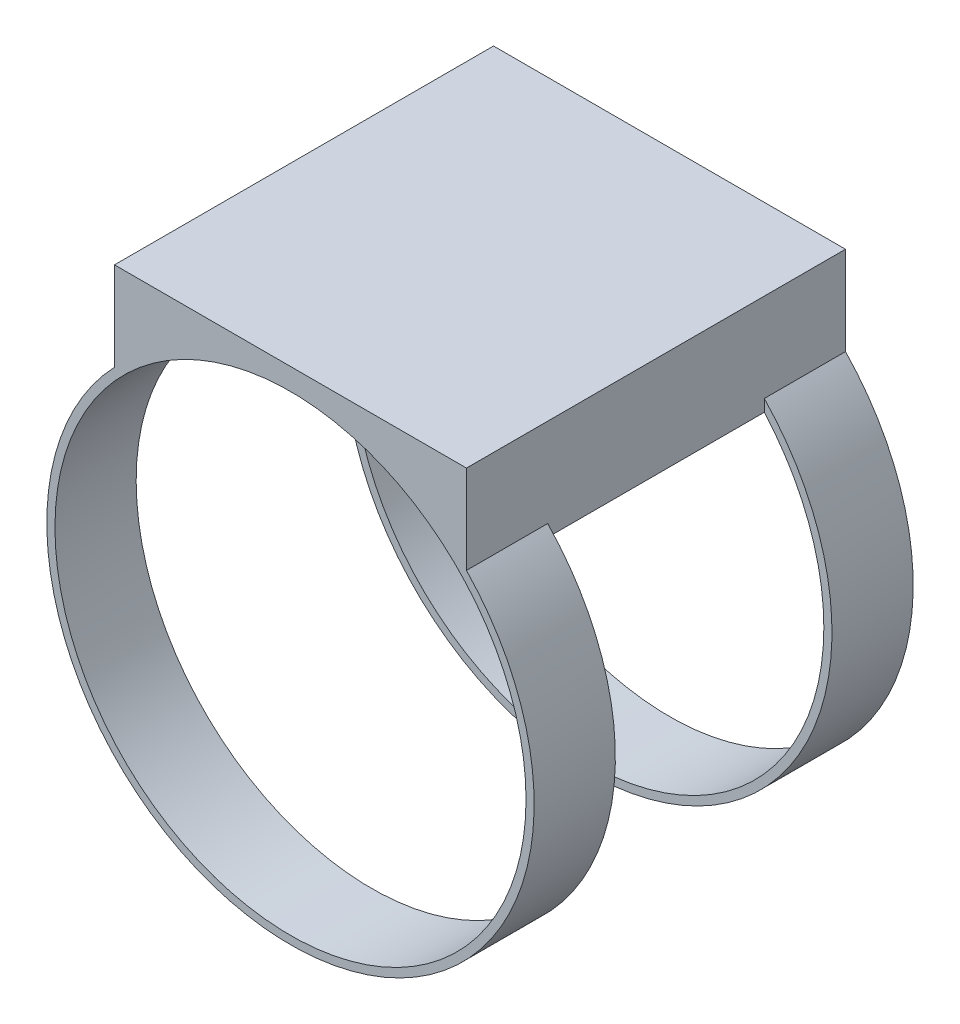
ISO-10303-21;
HEADER;
FILE_DESCRIPTION(('STEP AP214'),'2;1');
FILE_NAME('part.step','',(''),(''),'','','');
FILE_SCHEMA(('AUTOMOTIVE_DESIGN { 1 0 10303 214 1 1 1 1 }'));
ENDSEC;
DATA;
#1=APPLICATION_CONTEXT('core data for automotive mechanical design processes');
#2=APPLICATION_PROTOCOL_DEFINITION('international standard','automotive_design',2000,#1);
#3=PRODUCT_CONTEXT('',#1,'mechanical');
#4=PRODUCT('Part','Part','',(#3));
#5=PRODUCT_RELATED_PRODUCT_CATEGORY('part','',(#4));
#6=PRODUCT_DEFINITION_FORMATION('','',#4);
#7=PRODUCT_DEFINITION_CONTEXT('part definition',#1,'design');
#8=PRODUCT_DEFINITION('design','',#6,#7);
#9=PRODUCT_DEFINITION_SHAPE('','',#8);
#10=(LENGTH_UNIT() NAMED_UNIT(*) SI_UNIT(.MILLI.,.METRE.));
#11=(NAMED_UNIT(*) PLANE_ANGLE_UNIT() SI_UNIT($,.RADIAN.));
#12=(NAMED_UNIT(*) SI_UNIT($,.STERADIAN.) SOLID_ANGLE_UNIT());
#13=UNCERTAINTY_MEASURE_WITH_UNIT(LENGTH_MEASURE(1.E-05),#10,'distance_accuracy_value','');
#14=(GEOMETRIC_REPRESENTATION_CONTEXT(3) GLOBAL_UNCERTAINTY_ASSIGNED_CONTEXT((#13)) GLOBAL_UNIT_ASSIGNED_CONTEXT((#10,
#11,#12)) REPRESENTATION_CONTEXT('',''));
#15=CARTESIAN_POINT('',(0.,0.,0.));
#16=DIRECTION('',(0.,0.,1.));
#17=DIRECTION('',(1.,0.,0.));
#18=AXIS2_PLACEMENT_3D('',#15,#16,#17);
#19=CARTESIAN_POINT('',(0.,0.,30.));
#20=DIRECTION('',(0.,0.,1.));
#21=DIRECTION('',(1.,0.,0.));
#22=AXIS2_PLACEMENT_3D('',#19,#20,#21);
#23=PLANE('',#22);
#24=CARTESIAN_POINT('',(0.,0.,30.));
#25=DIRECTION('',(0.,0.,1.));
#26=DIRECTION('',(1.,0.,0.));
#27=AXIS2_PLACEMENT_3D('',#24,#25,#26);
#28=CIRCLE('',#27,90.);
#29=CARTESIAN_POINT('',(-65.,62.2494979899437,30.));
#30=VERTEX_POINT('',#29);
#31=CARTESIAN_POINT('',(65.,62.2494979899437,30.));
#32=VERTEX_POINT('',#31);
#33=EDGE_CURVE('E170',#30,#32,#28,.T.);
#34=ORIENTED_EDGE('',*,*,#33,.T.);
#35=DIRECTION('',(0.,-1.,0.));
#36=VECTOR('',#35,1.);
#37=CARTESIAN_POINT('',(65.,0.,30.));
#38=LINE('',#37,#36);
#39=CARTESIAN_POINT('',(65.,57.8273291792038,30.));
#40=VERTEX_POINT('',#39);
#41=EDGE_CURVE('E11',#32,#40,#38,.T.);
#42=ORIENTED_EDGE('',*,*,#41,.T.);
#43=CARTESIAN_POINT('',(0.,0.,30.));
#44=DIRECTION('',(0.,0.,1.));
#45=DIRECTION('',(1.,0.,0.));
#46=AXIS2_PLACEMENT_3D('',#43,#44,#45);
#47=CIRCLE('',#46,87.);
#48=CARTESIAN_POINT('',(-65.,57.8273291792038,30.));
#49=VERTEX_POINT('',#48);
#50=EDGE_CURVE('E195',#49,#40,#47,.T.);
#51=ORIENTED_EDGE('',*,*,#50,.F.);
#52=DIRECTION('',(0.,-1.,0.));
#53=VECTOR('',#52,1.);
#54=CARTESIAN_POINT('',(-65.,0.,30.));
#55=LINE('',#54,#53);
#56=EDGE_CURVE('E51',#30,#49,#55,.T.);
#57=ORIENTED_EDGE('',*,*,#56,.F.);
#58=EDGE_LOOP('',(#34,#42,#51,#57));
#59=FACE_BOUND('',#58,.T.);
#60=ADVANCED_FACE('F41',(#59),#23,.T.);
#61=CARTESIAN_POINT('',(0.,0.,30.));
#62=DIRECTION('',(0.,0.,-1.));
#63=DIRECTION('',(-1.,0.,0.));
#64=AXIS2_PLACEMENT_3D('',#61,#62,#63);
#65=CYLINDRICAL_SURFACE('',#64,90.);
#66=DIRECTION('',(0.,0.,-1.));
#67=VECTOR('',#66,1.);
#68=CARTESIAN_POINT('',(-65.,62.2494979899437,30.));
#69=LINE('',#68,#67);
#70=CARTESIAN_POINT('',(-65.,62.2494979899437,0.));
#71=VERTEX_POINT('',#70);
#72=EDGE_CURVE('E119',#71,#30,#69,.F.);
#73=ORIENTED_EDGE('',*,*,#72,.F.);
#74=CARTESIAN_POINT('',(0.,0.,0.));
#75=DIRECTION('',(0.,0.,1.));
#76=DIRECTION('',(1.,0.,0.));
#77=AXIS2_PLACEMENT_3D('',#74,#75,#76);
#78=CIRCLE('',#77,90.);
#79=CARTESIAN_POINT('',(65.,62.2494979899437,0.));
#80=VERTEX_POINT('',#79);
#81=EDGE_CURVE('E45',#71,#80,#78,.T.);
#82=ORIENTED_EDGE('',*,*,#81,.T.);
#83=DIRECTION('',(0.,0.,-1.));
#84=VECTOR('',#83,1.);
#85=CARTESIAN_POINT('',(65.,62.2494979899437,30.));
#86=LINE('',#85,#84);
#87=EDGE_CURVE('E175',#32,#80,#86,.T.);
#88=ORIENTED_EDGE('',*,*,#87,.F.);
#89=ORIENTED_EDGE('',*,*,#33,.F.);
#90=EDGE_LOOP('',(#73,#82,#88,#89));
#91=FACE_BOUND('',#90,.T.);
#92=ADVANCED_FACE('F43',(#91),#65,.T.);
#93=CARTESIAN_POINT('',(0.,0.,0.));
#94=DIRECTION('',(0.,0.,1.));
#95=DIRECTION('',(1.,0.,0.));
#96=AXIS2_PLACEMENT_3D('',#93,#94,#95);
#97=PLANE('',#96);
#98=ORIENTED_EDGE('',*,*,#81,.F.);
#99=DIRECTION('',(0.,-1.,0.));
#100=VECTOR('',#99,1.);
#101=CARTESIAN_POINT('',(-65.,95.,0.));
#102=LINE('',#101,#100);
#103=CARTESIAN_POINT('',(-65.,95.,0.));
#104=VERTEX_POINT('',#103);
#105=EDGE_CURVE('E188',#104,#71,#102,.T.);
#106=ORIENTED_EDGE('',*,*,#105,.F.);
#107=DIRECTION('',(-1.,0.,0.));
#108=VECTOR('',#107,1.);
#109=CARTESIAN_POINT('',(-65.,95.,0.));
#110=LINE('',#109,#108);
#111=CARTESIAN_POINT('',(65.,95.,0.));
#112=VERTEX_POINT('',#111);
#113=EDGE_CURVE('E185',#112,#104,#110,.T.);
#114=ORIENTED_EDGE('',*,*,#113,.F.);
#115=DIRECTION('',(0.,-1.,0.));
#116=VECTOR('',#115,1.);
#117=CARTESIAN_POINT('',(65.,95.,0.));
#118=LINE('',#117,#116);
#119=EDGE_CURVE('E191',#112,#80,#118,.T.);
#120=ORIENTED_EDGE('',*,*,#119,.T.);
#121=EDGE_LOOP('',(#98,#106,#114,#120));
#122=FACE_BOUND('',#121,.T.);
#123=CARTESIAN_POINT('',(0.,0.,0.));
#124=DIRECTION('',(0.,0.,1.));
#125=DIRECTION('',(1.,0.,0.));
#126=AXIS2_PLACEMENT_3D('',#123,#124,#125);
#127=CIRCLE('',#126,87.);
#128=CARTESIAN_POINT('',(87.,0.,0.));
#129=VERTEX_POINT('',#128);
#130=EDGE_CURVE('E194',#129,#129,#127,.T.);
#131=ORIENTED_EDGE('',*,*,#130,.T.);
#132=EDGE_LOOP('',(#131));
#133=FACE_BOUND('',#132,.T.);
#134=ADVANCED_FACE('F221',(#122,#133),#97,.F.);
#135=CARTESIAN_POINT('',(0.,0.,30.));
#136=DIRECTION('',(0.,0.,-1.));
#137=DIRECTION('',(-1.,0.,0.));
#138=AXIS2_PLACEMENT_3D('',#135,#136,#137);
#139=CYLINDRICAL_SURFACE('',#138,87.);
#140=ORIENTED_EDGE('',*,*,#50,.T.);
#141=DIRECTION('',(0.,0.,-1.));
#142=VECTOR('',#141,1.);
#143=CARTESIAN_POINT('',(65.,57.8273291792038,70.));
#144=LINE('',#143,#142);
#145=CARTESIAN_POINT('',(65.,57.8273291792038,110.));
#146=VERTEX_POINT('',#145);
#147=EDGE_CURVE('E120',#146,#40,#144,.T.);
#148=ORIENTED_EDGE('',*,*,#147,.F.);
#149=CARTESIAN_POINT('',(0.,0.,110.));
#150=DIRECTION('',(0.,0.,1.));
#151=DIRECTION('',(1.,0.,0.));
#152=AXIS2_PLACEMENT_3D('',#149,#150,#151);
#153=CIRCLE('',#152,87.);
#154=CARTESIAN_POINT('',(-65.,57.8273291792038,110.));
#155=VERTEX_POINT('',#154);
#156=EDGE_CURVE('E123',#155,#146,#153,.T.);
#157=ORIENTED_EDGE('',*,*,#156,.F.);
#158=DIRECTION('',(0.,0.,-1.));
#159=VECTOR('',#158,1.);
#160=CARTESIAN_POINT('',(-65.,57.8273291792038,70.));
#161=LINE('',#160,#159);
#162=EDGE_CURVE('E108',#155,#49,#161,.T.);
#163=ORIENTED_EDGE('',*,*,#162,.T.);
#164=EDGE_LOOP('',(#140,#148,#157,#163));
#165=FACE_BOUND('',#164,.T.);
#166=ORIENTED_EDGE('',*,*,#130,.F.);
#167=EDGE_LOOP('',(#166));
#168=FACE_BOUND('',#167,.T.);
#169=CARTESIAN_POINT('',(0.,0.,140.));
#170=DIRECTION('',(0.,0.,1.));
#171=DIRECTION('',(1.,0.,0.));
#172=AXIS2_PLACEMENT_3D('',#169,#170,#171);
#173=CIRCLE('',#172,87.);
#174=CARTESIAN_POINT('',(87.,0.,140.));
#175=VERTEX_POINT('',#174);
#176=EDGE_CURVE('E132',#175,#175,#173,.T.);
#177=ORIENTED_EDGE('',*,*,#176,.T.);
#178=EDGE_LOOP('',(#177));
#179=FACE_BOUND('',#178,.T.);
#180=ADVANCED_FACE('F124',(#165,#168,#179),#139,.F.);
#181=CARTESIAN_POINT('',(-65.,95.,0.));
#182=DIRECTION('',(1.,0.,0.));
#183=DIRECTION('',(0.,0.,-1.));
#184=AXIS2_PLACEMENT_3D('',#181,#182,#183);
#185=PLANE('',#184);
#186=ORIENTED_EDGE('',*,*,#105,.T.);
#187=ORIENTED_EDGE('',*,*,#72,.T.);
#188=ORIENTED_EDGE('',*,*,#56,.T.);
#189=ORIENTED_EDGE('',*,*,#162,.F.);
#190=DIRECTION('',(0.,-1.,0.));
#191=VECTOR('',#190,1.);
#192=CARTESIAN_POINT('',(-65.,0.,110.));
#193=LINE('',#192,#191);
#194=CARTESIAN_POINT('',(-65.,62.2494979899437,110.));
#195=VERTEX_POINT('',#194);
#196=EDGE_CURVE('E114',#195,#155,#193,.T.);
#197=ORIENTED_EDGE('',*,*,#196,.F.);
#198=DIRECTION('',(0.,0.,1.));
#199=VECTOR('',#198,1.);
#200=CARTESIAN_POINT('',(-65.,62.2494979899437,110.));
#201=LINE('',#200,#199);
#202=CARTESIAN_POINT('',(-65.,62.2494979899437,140.));
#203=VERTEX_POINT('',#202);
#204=EDGE_CURVE('E145',#203,#195,#201,.F.);
#205=ORIENTED_EDGE('',*,*,#204,.F.);
#206=DIRECTION('',(0.,-1.,0.));
#207=VECTOR('',#206,1.);
#208=CARTESIAN_POINT('',(-65.,95.,140.));
#209=LINE('',#208,#207);
#210=CARTESIAN_POINT('',(-65.,95.,140.));
#211=VERTEX_POINT('',#210);
#212=EDGE_CURVE('E156',#211,#203,#209,.T.);
#213=ORIENTED_EDGE('',*,*,#212,.F.);
#214=DIRECTION('',(0.,0.,1.));
#215=VECTOR('',#214,1.);
#216=CARTESIAN_POINT('',(-65.,95.,0.));
#217=LINE('',#216,#215);
#218=EDGE_CURVE('E179',#104,#211,#217,.T.);
#219=ORIENTED_EDGE('',*,*,#218,.F.);
#220=EDGE_LOOP('',(#186,#187,#188,#189,#197,#205,#213,#219));
#221=FACE_BOUND('',#220,.T.);
#222=ADVANCED_FACE('F111',(#221),#185,.F.);
#223=CARTESIAN_POINT('',(65.,95.,0.));
#224=DIRECTION('',(-1.,0.,0.));
#225=DIRECTION('',(0.,0.,1.));
#226=AXIS2_PLACEMENT_3D('',#223,#224,#225);
#227=PLANE('',#226);
#228=DIRECTION('',(0.,0.,-1.));
#229=VECTOR('',#228,1.);
#230=CARTESIAN_POINT('',(65.,95.,0.));
#231=LINE('',#230,#229);
#232=CARTESIAN_POINT('',(65.,95.,140.));
#233=VERTEX_POINT('',#232);
#234=EDGE_CURVE('E182',#233,#112,#231,.T.);
#235=ORIENTED_EDGE('',*,*,#234,.F.);
#236=DIRECTION('',(0.,-1.,0.));
#237=VECTOR('',#236,1.);
#238=CARTESIAN_POINT('',(65.,95.,140.));
#239=LINE('',#238,#237);
#240=CARTESIAN_POINT('',(65.,62.2494979899437,140.));
#241=VERTEX_POINT('',#240);
#242=EDGE_CURVE('E159',#233,#241,#239,.T.);
#243=ORIENTED_EDGE('',*,*,#242,.T.);
#244=DIRECTION('',(0.,0.,1.));
#245=VECTOR('',#244,1.);
#246=CARTESIAN_POINT('',(65.,62.2494979899437,110.));
#247=LINE('',#246,#245);
#248=CARTESIAN_POINT('',(65.,62.2494979899437,110.));
#249=VERTEX_POINT('',#248);
#250=EDGE_CURVE('E148',#249,#241,#247,.T.);
#251=ORIENTED_EDGE('',*,*,#250,.F.);
#252=DIRECTION('',(0.,-1.,0.));
#253=VECTOR('',#252,1.);
#254=CARTESIAN_POINT('',(65.,0.,110.));
#255=LINE('',#254,#253);
#256=EDGE_CURVE('E138',#249,#146,#255,.T.);
#257=ORIENTED_EDGE('',*,*,#256,.T.);
#258=ORIENTED_EDGE('',*,*,#147,.T.);
#259=ORIENTED_EDGE('',*,*,#41,.F.);
#260=ORIENTED_EDGE('',*,*,#87,.T.);
#261=ORIENTED_EDGE('',*,*,#119,.F.);
#262=EDGE_LOOP('',(#235,#243,#251,#257,#258,#259,#260,#261));
#263=FACE_BOUND('',#262,.T.);
#264=ADVANCED_FACE('F204',(#263),#227,.F.);
#265=CARTESIAN_POINT('',(0.,95.,0.));
#266=DIRECTION('',(0.,1.,0.));
#267=DIRECTION('',(0.,0.,1.));
#268=AXIS2_PLACEMENT_3D('',#265,#266,#267);
#269=PLANE('',#268);
#270=ORIENTED_EDGE('',*,*,#218,.T.);
#271=DIRECTION('',(-1.,0.,0.));
#272=VECTOR('',#271,1.);
#273=CARTESIAN_POINT('',(-65.,95.,140.));
#274=LINE('',#273,#272);
#275=EDGE_CURVE('E152',#233,#211,#274,.T.);
#276=ORIENTED_EDGE('',*,*,#275,.F.);
#277=ORIENTED_EDGE('',*,*,#234,.T.);
#278=ORIENTED_EDGE('',*,*,#113,.T.);
#279=EDGE_LOOP('',(#270,#276,#277,#278));
#280=FACE_BOUND('',#279,.T.);
#281=ADVANCED_FACE('F217',(#280),#269,.T.);
#282=CARTESIAN_POINT('',(0.,0.,110.));
#283=DIRECTION('',(0.,0.,-1.));
#284=DIRECTION('',(1.,0.,0.));
#285=AXIS2_PLACEMENT_3D('',#282,#283,#284);
#286=PLANE('',#285);
#287=CARTESIAN_POINT('',(0.,0.,110.));
#288=DIRECTION('',(0.,0.,1.));
#289=DIRECTION('',(1.,0.,0.));
#290=AXIS2_PLACEMENT_3D('',#287,#288,#289);
#291=CIRCLE('',#290,90.);
#292=EDGE_CURVE('E136',#195,#249,#291,.T.);
#293=ORIENTED_EDGE('',*,*,#292,.F.);
#294=ORIENTED_EDGE('',*,*,#196,.T.);
#295=ORIENTED_EDGE('',*,*,#156,.T.);
#296=ORIENTED_EDGE('',*,*,#256,.F.);
#297=EDGE_LOOP('',(#293,#294,#295,#296));
#298=FACE_BOUND('',#297,.T.);
#299=ADVANCED_FACE('F134',(#298),#286,.T.);
#300=CARTESIAN_POINT('',(0.,0.,110.));
#301=DIRECTION('',(0.,0.,1.));
#302=DIRECTION('',(-1.,0.,0.));
#303=AXIS2_PLACEMENT_3D('',#300,#301,#302);
#304=CYLINDRICAL_SURFACE('',#303,90.);
#305=ORIENTED_EDGE('',*,*,#204,.T.);
#306=ORIENTED_EDGE('',*,*,#292,.T.);
#307=ORIENTED_EDGE('',*,*,#250,.T.);
#308=CARTESIAN_POINT('',(0.,0.,140.));
#309=DIRECTION('',(0.,0.,1.));
#310=DIRECTION('',(1.,0.,0.));
#311=AXIS2_PLACEMENT_3D('',#308,#309,#310);
#312=CIRCLE('',#311,90.);
#313=EDGE_CURVE('E131',#203,#241,#312,.T.);
#314=ORIENTED_EDGE('',*,*,#313,.F.);
#315=EDGE_LOOP('',(#305,#306,#307,#314));
#316=FACE_BOUND('',#315,.T.);
#317=ADVANCED_FACE('F207',(#316),#304,.T.);
#318=CARTESIAN_POINT('',(0.,0.,140.));
#319=DIRECTION('',(0.,0.,-1.));
#320=DIRECTION('',(1.,0.,0.));
#321=AXIS2_PLACEMENT_3D('',#318,#319,#320);
#322=PLANE('',#321);
#323=ORIENTED_EDGE('',*,*,#313,.T.);
#324=ORIENTED_EDGE('',*,*,#242,.F.);
#325=ORIENTED_EDGE('',*,*,#275,.T.);
#326=ORIENTED_EDGE('',*,*,#212,.T.);
#327=EDGE_LOOP('',(#323,#324,#325,#326));
#328=FACE_BOUND('',#327,.T.);
#329=ORIENTED_EDGE('',*,*,#176,.F.);
#330=EDGE_LOOP('',(#329));
#331=FACE_BOUND('',#330,.T.);
#332=ADVANCED_FACE('F214',(#328,#331),#322,.F.);
#333=CLOSED_SHELL('',(#60,#92,#134,#180,#222,#264,#281,#299,#317,#332));
#334=MANIFOLD_SOLID_BREP('B2',#333);
#335=ADVANCED_BREP_SHAPE_REPRESENTATION('',(#18,#334),#14);
#336=SHAPE_DEFINITION_REPRESENTATION(#9,#335);
ENDSEC;
END-ISO-10303-21;
